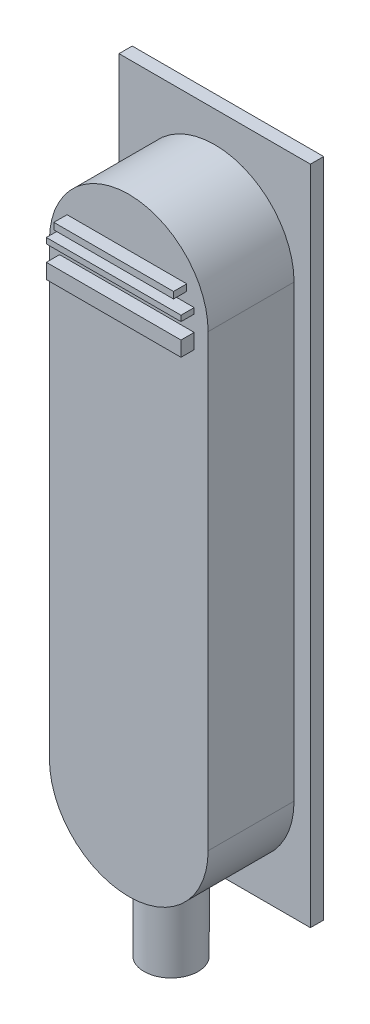
ISO-10303-21;
HEADER;
FILE_DESCRIPTION(('STEP AP214'),'2;1');
FILE_NAME('part.step','',(''),(''),'','','');
FILE_SCHEMA(('AUTOMOTIVE_DESIGN { 1 0 10303 214 1 1 1 1 }'));
ENDSEC;
DATA;
#1=APPLICATION_CONTEXT('core data for automotive mechanical design processes');
#2=APPLICATION_PROTOCOL_DEFINITION('international standard','automotive_design',2000,#1);
#3=PRODUCT_CONTEXT('',#1,'mechanical');
#4=PRODUCT('Part','Part','',(#3));
#5=PRODUCT_RELATED_PRODUCT_CATEGORY('part','',(#4));
#6=PRODUCT_DEFINITION_FORMATION('','',#4);
#7=PRODUCT_DEFINITION_CONTEXT('part definition',#1,'design');
#8=PRODUCT_DEFINITION('design','',#6,#7);
#9=PRODUCT_DEFINITION_SHAPE('','',#8);
#10=(LENGTH_UNIT() NAMED_UNIT(*) SI_UNIT(.MILLI.,.METRE.));
#11=(NAMED_UNIT(*) PLANE_ANGLE_UNIT() SI_UNIT($,.RADIAN.));
#12=(NAMED_UNIT(*) SI_UNIT($,.STERADIAN.) SOLID_ANGLE_UNIT());
#13=UNCERTAINTY_MEASURE_WITH_UNIT(LENGTH_MEASURE(1.E-05),#10,'distance_accuracy_value','');
#14=(GEOMETRIC_REPRESENTATION_CONTEXT(3) GLOBAL_UNCERTAINTY_ASSIGNED_CONTEXT((#13)) GLOBAL_UNIT_ASSIGNED_CONTEXT((#10,
#11,#12)) REPRESENTATION_CONTEXT('',''));
#15=CARTESIAN_POINT('',(0.,0.,0.));
#16=DIRECTION('',(0.,0.,1.));
#17=DIRECTION('',(1.,0.,0.));
#18=AXIS2_PLACEMENT_3D('',#15,#16,#17);
#19=CARTESIAN_POINT('',(-0.000521742011241834,-4.4779740051139,4.58345440240459));
#20=DIRECTION('',(0.,0.,-1.));
#21=DIRECTION('',(-1.,0.,0.));
#22=AXIS2_PLACEMENT_3D('',#19,#20,#21);
#23=CYLINDRICAL_SURFACE('',#22,1.5);
#24=CARTESIAN_POINT('',(-0.000521742011241834,-4.4779740051139,2.9584544024046));
#25=DIRECTION('',(0.,0.,1.));
#26=DIRECTION('',(1.,0.,0.));
#27=AXIS2_PLACEMENT_3D('',#24,#25,#26);
#28=CIRCLE('',#27,1.5);
#29=CARTESIAN_POINT('',(-1.50052174201124,-4.4779740051139,2.9584544024046));
#30=VERTEX_POINT('',#29);
#31=CARTESIAN_POINT('',(1.49947825798876,-4.4779740051139,2.9584544024046));
#32=VERTEX_POINT('',#31);
#33=EDGE_CURVE('E288',#30,#32,#28,.T.);
#34=ORIENTED_EDGE('',*,*,#33,.T.);
#35=DIRECTION('',(0.,0.,-1.));
#36=VECTOR('',#35,1.);
#37=CARTESIAN_POINT('',(1.49947825798876,-4.4779740051139,4.58345440240459));
#38=LINE('',#37,#36);
#39=CARTESIAN_POINT('',(1.49947825798876,-4.4779740051139,4.58345440240459));
#40=VERTEX_POINT('',#39);
#41=EDGE_CURVE('E295',#40,#32,#38,.T.);
#42=ORIENTED_EDGE('',*,*,#41,.F.);
#43=CARTESIAN_POINT('',(-0.000521742011241834,-4.4779740051139,4.58345440240459));
#44=DIRECTION('',(0.,0.,1.));
#45=DIRECTION('',(1.,0.,0.));
#46=AXIS2_PLACEMENT_3D('',#43,#44,#45);
#47=CIRCLE('',#46,1.5);
#48=CARTESIAN_POINT('',(-1.50052174201124,-4.4779740051139,4.58345440240459));
#49=VERTEX_POINT('',#48);
#50=EDGE_CURVE('E278',#49,#40,#47,.T.);
#51=ORIENTED_EDGE('',*,*,#50,.F.);
#52=DIRECTION('',(0.,0.,-1.));
#53=VECTOR('',#52,1.);
#54=CARTESIAN_POINT('',(-1.50052174201124,-4.4779740051139,4.58345440240459));
#55=LINE('',#54,#53);
#56=EDGE_CURVE('E298',#49,#30,#55,.T.);
#57=ORIENTED_EDGE('',*,*,#56,.T.);
#58=EDGE_LOOP('',(#34,#42,#51,#57));
#59=FACE_BOUND('',#58,.T.);
#60=CARTESIAN_POINT('',(0.,-5.97797391437566,3.27301159441511));
#61=CARTESIAN_POINT('',(0.0278596062312423,-5.97796439551194,3.27301133718254));
#62=CARTESIAN_POINT('',(0.0557171524043528,-5.97717128467946,3.27529636312219));
#63=CARTESIAN_POINT('',(0.110609010802156,-5.97410432053571,3.28434634134334));
#64=CARTESIAN_POINT('',(0.137643273193168,-5.97183037777485,3.29111156425131));
#65=CARTESIAN_POINT('',(0.190089328378379,-5.96604759221962,3.30886138390101));
#66=CARTESIAN_POINT('',(0.215503824775274,-5.9625408744391,3.3198387229067));
#67=CARTESIAN_POINT('',(0.264130524263755,-5.95464823053673,3.3456676499806));
#68=CARTESIAN_POINT('',(0.287342261463514,-5.95026211902771,3.36052005516035));
#69=CARTESIAN_POINT('',(0.331741622943114,-5.94089331207366,3.39423956675531));
#70=CARTESIAN_POINT('',(0.352838913457008,-5.93589585759858,3.41322149132755));
#71=CARTESIAN_POINT('',(0.391620188533736,-5.92594717733838,3.45441721375066));
#72=CARTESIAN_POINT('',(0.409303374389715,-5.92099596262792,3.4766317657265));
#73=CARTESIAN_POINT('',(0.441278622976148,-5.91153584305989,3.52448544728249));
#74=CARTESIAN_POINT('',(0.455451812991,-5.90704486704399,3.55020789392706));
#75=CARTESIAN_POINT('',(0.479231981948581,-5.89923899354879,3.60384935303553));
#76=CARTESIAN_POINT('',(0.488840432024218,-5.89592371725023,3.63176765442974));
#77=CARTESIAN_POINT('',(0.502875883786884,-5.89100080468927,3.68797651863999));
#78=CARTESIAN_POINT('',(0.507473063384227,-5.88933726668165,3.7162195434678));
#79=CARTESIAN_POINT('',(0.511887569865075,-5.88774091542438,3.77312129987456));
#80=CARTESIAN_POINT('',(0.511706456661077,-5.88780753734985,3.80177989273442));
#81=CARTESIAN_POINT('',(0.506701172635622,-5.88961518120781,3.85723328258244));
#82=CARTESIAN_POINT('',(0.502100941662519,-5.89127544192861,3.88405138693249));
#83=CARTESIAN_POINT('',(0.488754092161592,-5.89595096012649,3.93650946084317));
#84=CARTESIAN_POINT('',(0.480006955293608,-5.89896638698934,3.96214928268545));
#85=CARTESIAN_POINT('',(0.458472092414773,-5.90606874416386,4.01202291524384));
#86=CARTESIAN_POINT('',(0.445619436643038,-5.91017269948723,4.03622616039743));
#87=CARTESIAN_POINT('',(0.41628355465511,-5.91898316616598,4.08220211986134));
#88=CARTESIAN_POINT('',(0.399799240755676,-5.92368985786396,4.10397410305761));
#89=CARTESIAN_POINT('',(0.362600981872608,-5.93349145530541,4.14572524200795));
#90=CARTESIAN_POINT('',(0.341704630283148,-5.93859349414899,4.16554055143805));
#91=CARTESIAN_POINT('',(0.296823455717967,-5.94838645153926,4.2014294370227));
#92=CARTESIAN_POINT('',(0.272838307184198,-5.95307732666174,4.2175026182562));
#93=CARTESIAN_POINT('',(0.222099136400491,-5.96158712424596,4.24559204770108));
#94=CARTESIAN_POINT('',(0.195317850347669,-5.96539601425525,4.25756229758664));
#95=CARTESIAN_POINT('',(0.139960522387497,-5.97164032239769,4.27677605366025));
#96=CARTESIAN_POINT('',(0.11138513779979,-5.97407624033265,4.28402128004552));
#97=CARTESIAN_POINT('',(0.0546342008370358,-5.97721677631679,4.29328505992716));
#98=CARTESIAN_POINT('',(0.0264987122482518,-5.97799450298184,4.29552454405959));
#99=CARTESIAN_POINT('',(-0.0297532879968511,-5.97795269245184,4.29534472817881));
#100=CARTESIAN_POINT('',(-0.0578698021406586,-5.97713343973039,4.29292625789867));
#101=CARTESIAN_POINT('',(-0.112387008302642,-5.97403868752265,4.28367309813346));
#102=CARTESIAN_POINT('',(-0.138813877131954,-5.97180856015729,4.27697594239041));
#103=CARTESIAN_POINT('',(-0.190157275113954,-5.96616283103993,4.25952874083205));
#104=CARTESIAN_POINT('',(-0.215073610275224,-5.96274707740024,4.24877817572911));
#105=CARTESIAN_POINT('',(-0.263435162900429,-5.95496178497075,4.22321038298086));
#106=CARTESIAN_POINT('',(-0.286822913713625,-5.95056909833839,4.20829171031274));
#107=CARTESIAN_POINT('',(-0.330834046766069,-5.94132642865761,4.17492950279566));
#108=CARTESIAN_POINT('',(-0.351456548946232,-5.93647630085804,4.1564848502886));
#109=CARTESIAN_POINT('',(-0.390373864702713,-5.92657260872661,4.11555725544957));
#110=CARTESIAN_POINT('',(-0.408511245107669,-5.92152034459849,4.09292392979953));
#111=CARTESIAN_POINT('',(-0.440752108382872,-5.91201746493948,4.04482791080466));
#112=CARTESIAN_POINT('',(-0.454855511359112,-5.90756686132555,4.01936516143621));
#113=CARTESIAN_POINT('',(-0.478574408309836,-5.89981158514208,3.96629195147886));
#114=CARTESIAN_POINT('',(-0.488194859951625,-5.89650564773849,3.93868390298999));
#115=CARTESIAN_POINT('',(-0.502603380358287,-5.89147088062371,3.88210005210946));
#116=CARTESIAN_POINT('',(-0.507393752522889,-5.88974129920747,3.85312490857471));
#117=CARTESIAN_POINT('',(-0.5118215175772,-5.88814332630366,3.79629813445725));
#118=CARTESIAN_POINT('',(-0.511720972506329,-5.88818027954173,3.76846936791535));
#119=CARTESIAN_POINT('',(-0.507019305339643,-5.88987567365864,3.71324757491687));
#120=CARTESIAN_POINT('',(-0.502418474525789,-5.89153400959313,3.68585452037536));
#121=CARTESIAN_POINT('',(-0.489035915735052,-5.89621312780591,3.63284908579933));
#122=CARTESIAN_POINT('',(-0.480342840313674,-5.89920495215265,3.60721156327817));
#123=CARTESIAN_POINT('',(-0.459095294885371,-5.90620186262058,3.55773984383358));
#124=CARTESIAN_POINT('',(-0.446539944717411,-5.91020717966632,3.53390605950229));
#125=CARTESIAN_POINT('',(-0.41726307472797,-5.91900489410456,3.48755100424346));
#126=CARTESIAN_POINT('',(-0.400378999912287,-5.92382466981028,3.46513763248021));
#127=CARTESIAN_POINT('',(-0.363194584988623,-5.93359673250275,3.42337769646215));
#128=CARTESIAN_POINT('',(-0.342893260518153,-5.93854905732451,3.40403201900526));
#129=CARTESIAN_POINT('',(-0.29844404474193,-5.94827332683384,3.36814929624245));
#130=CARTESIAN_POINT('',(-0.274171882806647,-5.95302936512929,3.35176131664988));
#131=CARTESIAN_POINT('',(-0.223058383678518,-5.96160056066927,3.32331399037117));
#132=CARTESIAN_POINT('',(-0.19621756948444,-5.96541590888268,3.31125376488377));
#133=CARTESIAN_POINT('',(-0.141548144668828,-5.97157535236576,3.29217211429463));
#134=CARTESIAN_POINT('',(-0.113773097652423,-5.97396004273484,3.28501075685486));
#135=CARTESIAN_POINT('',(-0.0573311222770037,-5.9771639801519,3.27543135802868));
#136=CARTESIAN_POINT('',(-0.0286644707346247,-5.97798370823952,3.27301185907913));
#137=CARTESIAN_POINT('',(0.,-5.97797391437566,3.27301159441511));
#138=B_SPLINE_CURVE_WITH_KNOTS('',3,(#60,#61,#62,#63,#64,#65,#66,#67,#68,#69,#70,#71,#72,#73,
#74,#75,#76,#77,#78,#79,#80,#81,#82,#83,#84,#85,#86,#87,#88,#89,#90,#91,#92,#93,#94,#95,#96,#97,
#98,#99,#100,#101,#102,#103,#104,#105,#106,#107,#108,#109,#110,#111,#112,#113,#114,#115,#116,
#117,#118,#119,#120,#121,#122,#123,#124,#125,#126,#127,#128,#129,#130,#131,#132,#133,#134,#135,
#136,#137),.UNSPECIFIED.,.T.,.F.,(4,2,2,2,2,2,2,2,2,2,2,2,2,2,2,2,2,2,2,2,2,2,2,2,2,2,2,2,2,2,2,
2,2,2,2,2,2,2,4),(0.,0.0834732795698338,0.166951601806458,0.250286727004861,0.333639438793975,
0.419701885142729,0.505784440891467,0.594473116802835,0.683133190539577,0.768678408073519,
0.854195699022027,0.935596126441956,1.017006731146,1.09977453471567,1.18256716106086,
1.26990112607005,1.35724430359197,1.44553690753127,1.53379734959829,1.61807831584274,
1.7023442702966,1.78402923340105,1.86572466483175,1.94961374637959,2.03352946314643,
2.12143779903642,2.20934787585408,2.29716050139182,2.38493123043886,2.46800454412655,
2.55107248123195,2.63241831684304,2.71378270383795,2.79882194865023,2.88388573165956,
2.97246402858449,3.06102432845497,3.14693556424119,3.23282038829406),.UNSPECIFIED.);
#139=CARTESIAN_POINT('',(0.,-5.97797391437566,3.27301159441511));
#140=VERTEX_POINT('',#139);
#141=EDGE_CURVE('E11',#140,#140,#138,.T.);
#142=ORIENTED_EDGE('',*,*,#141,.F.);
#143=EDGE_LOOP('',(#142));
#144=FACE_BOUND('',#143,.T.);
#145=ADVANCED_FACE('F40',(#59,#144),#23,.T.);
#146=CARTESIAN_POINT('',(-0.000521742011241656,4.0220259948861,4.58345440240459));
#147=DIRECTION('',(0.,0.,1.));
#148=DIRECTION('',(1.,0.,0.));
#149=AXIS2_PLACEMENT_3D('',#146,#147,#148);
#150=PLANE('',#149);
#151=CARTESIAN_POINT('',(-0.000521742011241656,4.0220259948861,4.58345440240459));
#152=DIRECTION('',(0.,0.,1.));
#153=DIRECTION('',(1.,0.,0.));
#154=AXIS2_PLACEMENT_3D('',#151,#152,#153);
#155=CIRCLE('',#154,1.5);
#156=CARTESIAN_POINT('',(1.49947825798876,4.0220259948861,4.58345440240459));
#157=VERTEX_POINT('',#156);
#158=CARTESIAN_POINT('',(-1.50052174201124,4.0220259948861,4.58345440240459));
#159=VERTEX_POINT('',#158);
#160=EDGE_CURVE('E272',#157,#159,#155,.T.);
#161=ORIENTED_EDGE('',*,*,#160,.T.);
#162=DIRECTION('',(0.,-1.,0.));
#163=VECTOR('',#162,1.);
#164=CARTESIAN_POINT('',(-1.50052174201124,4.0220259948861,4.58345440240459));
#165=LINE('',#164,#163);
#166=EDGE_CURVE('E275',#159,#49,#165,.T.);
#167=ORIENTED_EDGE('',*,*,#166,.T.);
#168=ORIENTED_EDGE('',*,*,#50,.T.);
#169=DIRECTION('',(0.,1.,0.));
#170=VECTOR('',#169,1.);
#171=CARTESIAN_POINT('',(1.49947825798876,4.0220259948861,4.58345440240459));
#172=LINE('',#171,#170);
#173=EDGE_CURVE('E280',#40,#157,#172,.T.);
#174=ORIENTED_EDGE('',*,*,#173,.T.);
#175=EDGE_LOOP('',(#161,#167,#168,#174));
#176=FACE_BOUND('',#175,.T.);
#177=DIRECTION('',(1.,0.,0.));
#178=VECTOR('',#177,1.);
#179=CARTESIAN_POINT('',(-1.16730305464865,4.47972652427751,4.58345440240459));
#180=LINE('',#179,#178);
#181=CARTESIAN_POINT('',(-1.16730305464865,4.47972652427751,4.58345440240459));
#182=VERTEX_POINT('',#181);
#183=CARTESIAN_POINT('',(1.09554555167844,4.47972652427751,4.58345440240459));
#184=VERTEX_POINT('',#183);
#185=EDGE_CURVE('E256',#182,#184,#180,.T.);
#186=ORIENTED_EDGE('',*,*,#185,.F.);
#187=DIRECTION('',(0.,-1.,0.));
#188=VECTOR('',#187,1.);
#189=CARTESIAN_POINT('',(-1.16730305464865,4.60347605743602,4.58345440240459));
#190=LINE('',#189,#188);
#191=CARTESIAN_POINT('',(-1.16730305464865,4.60347605743602,4.58345440240459));
#192=VERTEX_POINT('',#191);
#193=EDGE_CURVE('E235',#192,#182,#190,.T.);
#194=ORIENTED_EDGE('',*,*,#193,.F.);
#195=DIRECTION('',(-1.,0.,0.));
#196=VECTOR('',#195,1.);
#197=CARTESIAN_POINT('',(-1.16730305464865,4.60347605743602,4.58345440240459));
#198=LINE('',#197,#196);
#199=CARTESIAN_POINT('',(1.09554555167844,4.60347605743602,4.58345440240459));
#200=VERTEX_POINT('',#199);
#201=EDGE_CURVE('E247',#200,#192,#198,.T.);
#202=ORIENTED_EDGE('',*,*,#201,.F.);
#203=DIRECTION('',(0.,1.,0.));
#204=VECTOR('',#203,1.);
#205=CARTESIAN_POINT('',(1.09554555167844,4.60347605743602,4.58345440240459));
#206=LINE('',#205,#204);
#207=EDGE_CURVE('E258',#184,#200,#206,.T.);
#208=ORIENTED_EDGE('',*,*,#207,.F.);
#209=EDGE_LOOP('',(#186,#194,#202,#208));
#210=FACE_BOUND('',#209,.T.);
#211=DIRECTION('',(1.,0.,0.));
#212=VECTOR('',#211,1.);
#213=CARTESIAN_POINT('',(-1.30873109254409,4.17919194374969,4.58345440240459));
#214=LINE('',#213,#212);
#215=CARTESIAN_POINT('',(-1.30873109254409,4.17919194374969,4.58345440240459));
#216=VERTEX_POINT('',#215);
#217=CARTESIAN_POINT('',(1.23697358957388,4.17919194374969,4.58345440240459));
#218=VERTEX_POINT('',#217);
#219=EDGE_CURVE('E230',#216,#218,#214,.T.);
#220=ORIENTED_EDGE('',*,*,#219,.F.);
#221=DIRECTION('',(0.,-1.,0.));
#222=VECTOR('',#221,1.);
#223=CARTESIAN_POINT('',(-1.30873109254409,4.28526297217127,4.58345440240459));
#224=LINE('',#223,#222);
#225=CARTESIAN_POINT('',(-1.30873109254409,4.28526297217127,4.58345440240459));
#226=VERTEX_POINT('',#225);
#227=EDGE_CURVE('E232',#226,#216,#224,.T.);
#228=ORIENTED_EDGE('',*,*,#227,.F.);
#229=DIRECTION('',(-1.,0.,0.));
#230=VECTOR('',#229,1.);
#231=CARTESIAN_POINT('',(-1.30873109254409,4.28526297217127,4.58345440240459));
#232=LINE('',#231,#230);
#233=CARTESIAN_POINT('',(1.23697358957388,4.28526297217127,4.58345440240459));
#234=VERTEX_POINT('',#233);
#235=EDGE_CURVE('E225',#234,#226,#232,.T.);
#236=ORIENTED_EDGE('',*,*,#235,.F.);
#237=DIRECTION('',(0.,1.,0.));
#238=VECTOR('',#237,1.);
#239=CARTESIAN_POINT('',(1.23697358957388,4.28526297217127,4.58345440240459));
#240=LINE('',#239,#238);
#241=EDGE_CURVE('E227',#218,#234,#240,.T.);
#242=ORIENTED_EDGE('',*,*,#241,.F.);
#243=EDGE_LOOP('',(#220,#228,#236,#242));
#244=FACE_BOUND('',#243,.T.);
#245=DIRECTION('',(1.,0.,0.));
#246=VECTOR('',#245,1.);
#247=CARTESIAN_POINT('',(-1.30873109254409,3.59580128743099,4.58345440240459));
#248=LINE('',#247,#246);
#249=CARTESIAN_POINT('',(-1.30873109254409,3.59580128743099,4.58345440240459));
#250=VERTEX_POINT('',#249);
#251=CARTESIAN_POINT('',(1.23697358957388,3.59580128743099,4.58345440240459));
#252=VERTEX_POINT('',#251);
#253=EDGE_CURVE('E204',#250,#252,#248,.T.);
#254=ORIENTED_EDGE('',*,*,#253,.F.);
#255=DIRECTION('',(0.,-1.,0.));
#256=VECTOR('',#255,1.);
#257=CARTESIAN_POINT('',(-1.30873109254409,3.87865736322187,4.58345440240459));
#258=LINE('',#257,#256);
#259=CARTESIAN_POINT('',(-1.30873109254409,3.87865736322187,4.58345440240459));
#260=VERTEX_POINT('',#259);
#261=EDGE_CURVE('E198',#260,#250,#258,.T.);
#262=ORIENTED_EDGE('',*,*,#261,.F.);
#263=DIRECTION('',(-1.,0.,0.));
#264=VECTOR('',#263,1.);
#265=CARTESIAN_POINT('',(-1.30873109254409,3.87865736322187,4.58345440240459));
#266=LINE('',#265,#264);
#267=CARTESIAN_POINT('',(1.23697358957388,3.87865736322187,4.58345440240459));
#268=VERTEX_POINT('',#267);
#269=EDGE_CURVE('E183',#268,#260,#266,.T.);
#270=ORIENTED_EDGE('',*,*,#269,.F.);
#271=DIRECTION('',(0.,1.,0.));
#272=VECTOR('',#271,1.);
#273=CARTESIAN_POINT('',(1.23697358957388,3.87865736322187,4.58345440240459));
#274=LINE('',#273,#272);
#275=EDGE_CURVE('E191',#252,#268,#274,.T.);
#276=ORIENTED_EDGE('',*,*,#275,.F.);
#277=EDGE_LOOP('',(#254,#262,#270,#276));
#278=FACE_BOUND('',#277,.T.);
#279=ADVANCED_FACE('F203',(#176,#210,#244,#278),#150,.T.);
#280=CARTESIAN_POINT('',(-1.81014872491624,-6.39582654831106,2.9584544024046));
#281=DIRECTION('',(1.,0.,0.));
#282=DIRECTION('',(0.,0.,-1.));
#283=AXIS2_PLACEMENT_3D('',#280,#281,#282);
#284=PLANE('',#283);
#285=DIRECTION('',(0.,-1.,0.));
#286=VECTOR('',#285,1.);
#287=CARTESIAN_POINT('',(-1.81014872491624,-6.39582654831106,2.70845440240459));
#288=LINE('',#287,#286);
#289=CARTESIAN_POINT('',(-1.81014872491624,6.10719808493144,2.70845440240459));
#290=VERTEX_POINT('',#289);
#291=CARTESIAN_POINT('',(-1.81014872491624,-6.39582654831106,2.70845440240459));
#292=VERTEX_POINT('',#291);
#293=EDGE_CURVE('E304',#290,#292,#288,.T.);
#294=ORIENTED_EDGE('',*,*,#293,.T.);
#295=DIRECTION('',(0.,0.,-1.));
#296=VECTOR('',#295,1.);
#297=CARTESIAN_POINT('',(-1.81014872491624,-6.39582654831106,2.9584544024046));
#298=LINE('',#297,#296);
#299=CARTESIAN_POINT('',(-1.81014872491624,-6.39582654831106,2.9584544024046));
#300=VERTEX_POINT('',#299);
#301=EDGE_CURVE('E53',#300,#292,#298,.T.);
#302=ORIENTED_EDGE('',*,*,#301,.F.);
#303=DIRECTION('',(0.,-1.,0.));
#304=VECTOR('',#303,1.);
#305=CARTESIAN_POINT('',(-1.81014872491624,-6.39582654831106,2.9584544024046));
#306=LINE('',#305,#304);
#307=CARTESIAN_POINT('',(-1.81014872491624,6.10719808493144,2.9584544024046));
#308=VERTEX_POINT('',#307);
#309=EDGE_CURVE('E305',#308,#300,#306,.T.);
#310=ORIENTED_EDGE('',*,*,#309,.F.);
#311=DIRECTION('',(0.,0.,-1.));
#312=VECTOR('',#311,1.);
#313=CARTESIAN_POINT('',(-1.81014872491624,6.10719808493144,2.9584544024046));
#314=LINE('',#313,#312);
#315=EDGE_CURVE('E315',#308,#290,#314,.T.);
#316=ORIENTED_EDGE('',*,*,#315,.T.);
#317=EDGE_LOOP('',(#294,#302,#310,#316));
#318=FACE_BOUND('',#317,.T.);
#319=ADVANCED_FACE('F42',(#318),#284,.F.);
#320=CARTESIAN_POINT('',(1.80910524089376,-6.39582654831106,2.9584544024046));
#321=DIRECTION('',(0.,1.,0.));
#322=DIRECTION('',(0.,0.,1.));
#323=AXIS2_PLACEMENT_3D('',#320,#321,#322);
#324=PLANE('',#323);
#325=DIRECTION('',(1.,0.,0.));
#326=VECTOR('',#325,1.);
#327=CARTESIAN_POINT('',(1.80910524089376,-6.39582654831106,2.70845440240459));
#328=LINE('',#327,#326);
#329=CARTESIAN_POINT('',(1.80910524089376,-6.39582654831106,2.70845440240459));
#330=VERTEX_POINT('',#329);
#331=EDGE_CURVE('E318',#292,#330,#328,.T.);
#332=ORIENTED_EDGE('',*,*,#331,.T.);
#333=DIRECTION('',(0.,0.,-1.));
#334=VECTOR('',#333,1.);
#335=CARTESIAN_POINT('',(1.80910524089376,-6.39582654831106,2.9584544024046));
#336=LINE('',#335,#334);
#337=CARTESIAN_POINT('',(1.80910524089376,-6.39582654831106,2.9584544024046));
#338=VERTEX_POINT('',#337);
#339=EDGE_CURVE('E328',#338,#330,#336,.T.);
#340=ORIENTED_EDGE('',*,*,#339,.F.);
#341=DIRECTION('',(1.,0.,0.));
#342=VECTOR('',#341,1.);
#343=CARTESIAN_POINT('',(1.80910524089376,-6.39582654831106,2.9584544024046));
#344=LINE('',#343,#342);
#345=EDGE_CURVE('E308',#300,#338,#344,.T.);
#346=ORIENTED_EDGE('',*,*,#345,.F.);
#347=ORIENTED_EDGE('',*,*,#301,.T.);
#348=EDGE_LOOP('',(#332,#340,#346,#347));
#349=FACE_BOUND('',#348,.T.);
#350=ADVANCED_FACE('F333',(#349),#324,.F.);
#351=CARTESIAN_POINT('',(1.80910524089376,-6.39582654831106,2.9584544024046));
#352=DIRECTION('',(-1.,0.,0.));
#353=DIRECTION('',(0.,0.,1.));
#354=AXIS2_PLACEMENT_3D('',#351,#352,#353);
#355=PLANE('',#354);
#356=DIRECTION('',(0.,1.,0.));
#357=VECTOR('',#356,1.);
#358=CARTESIAN_POINT('',(1.80910524089376,-6.39582654831106,2.70845440240459));
#359=LINE('',#358,#357);
#360=CARTESIAN_POINT('',(1.80910524089376,6.10719808493144,2.70845440240459));
#361=VERTEX_POINT('',#360);
#362=EDGE_CURVE('E320',#330,#361,#359,.T.);
#363=ORIENTED_EDGE('',*,*,#362,.T.);
#364=DIRECTION('',(0.,0.,-1.));
#365=VECTOR('',#364,1.);
#366=CARTESIAN_POINT('',(1.80910524089376,6.10719808493144,2.9584544024046));
#367=LINE('',#366,#365);
#368=CARTESIAN_POINT('',(1.80910524089376,6.10719808493144,2.9584544024046));
#369=VERTEX_POINT('',#368);
#370=EDGE_CURVE('E325',#369,#361,#367,.T.);
#371=ORIENTED_EDGE('',*,*,#370,.F.);
#372=DIRECTION('',(0.,1.,0.));
#373=VECTOR('',#372,1.);
#374=CARTESIAN_POINT('',(1.80910524089376,-6.39582654831106,2.9584544024046));
#375=LINE('',#374,#373);
#376=EDGE_CURVE('E311',#338,#369,#375,.T.);
#377=ORIENTED_EDGE('',*,*,#376,.F.);
#378=ORIENTED_EDGE('',*,*,#339,.T.);
#379=EDGE_LOOP('',(#363,#371,#377,#378));
#380=FACE_BOUND('',#379,.T.);
#381=ADVANCED_FACE('F345',(#380),#355,.F.);
#382=CARTESIAN_POINT('',(1.80910524089376,6.10719808493144,2.9584544024046));
#383=DIRECTION('',(0.,-1.,0.));
#384=DIRECTION('',(0.,0.,-1.));
#385=AXIS2_PLACEMENT_3D('',#382,#383,#384);
#386=PLANE('',#385);
#387=DIRECTION('',(-1.,0.,0.));
#388=VECTOR('',#387,1.);
#389=CARTESIAN_POINT('',(1.80910524089376,6.10719808493144,2.70845440240459));
#390=LINE('',#389,#388);
#391=EDGE_CURVE('E309',#361,#290,#390,.T.);
#392=ORIENTED_EDGE('',*,*,#391,.T.);
#393=ORIENTED_EDGE('',*,*,#315,.F.);
#394=DIRECTION('',(-1.,0.,0.));
#395=VECTOR('',#394,1.);
#396=CARTESIAN_POINT('',(1.80910524089376,6.10719808493144,2.9584544024046));
#397=LINE('',#396,#395);
#398=EDGE_CURVE('E313',#369,#308,#397,.T.);
#399=ORIENTED_EDGE('',*,*,#398,.F.);
#400=ORIENTED_EDGE('',*,*,#370,.T.);
#401=EDGE_LOOP('',(#392,#393,#399,#400));
#402=FACE_BOUND('',#401,.T.);
#403=ADVANCED_FACE('F349',(#402),#386,.F.);
#404=CARTESIAN_POINT('',(-0.000521742011241656,-0.14431423168981,2.9584544024046));
#405=DIRECTION('',(0.,0.,1.));
#406=DIRECTION('',(1.,0.,0.));
#407=AXIS2_PLACEMENT_3D('',#404,#405,#406);
#408=PLANE('',#407);
#409=CARTESIAN_POINT('',(-0.000521742011241656,4.0220259948861,2.9584544024046));
#410=DIRECTION('',(0.,0.,1.));
#411=DIRECTION('',(1.,0.,0.));
#412=AXIS2_PLACEMENT_3D('',#409,#410,#411);
#413=CIRCLE('',#412,1.5);
#414=CARTESIAN_POINT('',(1.49947825798876,4.0220259948861,2.9584544024046));
#415=VERTEX_POINT('',#414);
#416=CARTESIAN_POINT('',(-1.50052174201124,4.0220259948861,2.9584544024046));
#417=VERTEX_POINT('',#416);
#418=EDGE_CURVE('E271',#415,#417,#413,.T.);
#419=ORIENTED_EDGE('',*,*,#418,.F.);
#420=DIRECTION('',(0.,1.,0.));
#421=VECTOR('',#420,1.);
#422=CARTESIAN_POINT('',(1.49947825798876,4.0220259948861,2.9584544024046));
#423=LINE('',#422,#421);
#424=EDGE_CURVE('E276',#32,#415,#423,.T.);
#425=ORIENTED_EDGE('',*,*,#424,.F.);
#426=ORIENTED_EDGE('',*,*,#33,.F.);
#427=DIRECTION('',(0.,-1.,0.));
#428=VECTOR('',#427,1.);
#429=CARTESIAN_POINT('',(-1.50052174201124,4.0220259948861,2.9584544024046));
#430=LINE('',#429,#428);
#431=EDGE_CURVE('E285',#417,#30,#430,.T.);
#432=ORIENTED_EDGE('',*,*,#431,.F.);
#433=EDGE_LOOP('',(#419,#425,#426,#432));
#434=FACE_BOUND('',#433,.T.);
#435=ORIENTED_EDGE('',*,*,#309,.T.);
#436=ORIENTED_EDGE('',*,*,#345,.T.);
#437=ORIENTED_EDGE('',*,*,#376,.T.);
#438=ORIENTED_EDGE('',*,*,#398,.T.);
#439=EDGE_LOOP('',(#435,#436,#437,#438));
#440=FACE_BOUND('',#439,.T.);
#441=ADVANCED_FACE('F351',(#434,#440),#408,.T.);
#442=CARTESIAN_POINT('',(-0.000521742011241656,-0.14431423168981,2.70845440240459));
#443=DIRECTION('',(0.,0.,1.));
#444=DIRECTION('',(1.,0.,0.));
#445=AXIS2_PLACEMENT_3D('',#442,#443,#444);
#446=PLANE('',#445);
#447=ORIENTED_EDGE('',*,*,#293,.F.);
#448=ORIENTED_EDGE('',*,*,#391,.F.);
#449=ORIENTED_EDGE('',*,*,#362,.F.);
#450=ORIENTED_EDGE('',*,*,#331,.F.);
#451=EDGE_LOOP('',(#447,#448,#449,#450));
#452=FACE_BOUND('',#451,.T.);
#453=ADVANCED_FACE('F341',(#452),#446,.F.);
#454=CARTESIAN_POINT('',(-0.000521742011241656,4.0220259948861,4.58345440240459));
#455=DIRECTION('',(0.,0.,-1.));
#456=DIRECTION('',(-1.,0.,0.));
#457=AXIS2_PLACEMENT_3D('',#454,#455,#456);
#458=CYLINDRICAL_SURFACE('',#457,1.5);
#459=ORIENTED_EDGE('',*,*,#418,.T.);
#460=DIRECTION('',(0.,0.,-1.));
#461=VECTOR('',#460,1.);
#462=CARTESIAN_POINT('',(-1.50052174201124,4.0220259948861,4.58345440240459));
#463=LINE('',#462,#461);
#464=EDGE_CURVE('E301',#159,#417,#463,.T.);
#465=ORIENTED_EDGE('',*,*,#464,.F.);
#466=ORIENTED_EDGE('',*,*,#160,.F.);
#467=DIRECTION('',(0.,0.,-1.));
#468=VECTOR('',#467,1.);
#469=CARTESIAN_POINT('',(1.49947825798876,4.0220259948861,4.58345440240459));
#470=LINE('',#469,#468);
#471=EDGE_CURVE('E282',#157,#415,#470,.T.);
#472=ORIENTED_EDGE('',*,*,#471,.T.);
#473=EDGE_LOOP('',(#459,#465,#466,#472));
#474=FACE_BOUND('',#473,.T.);
#475=ADVANCED_FACE('F359',(#474),#458,.T.);
#476=CARTESIAN_POINT('',(-1.50052174201124,4.0220259948861,4.58345440240459));
#477=DIRECTION('',(1.,0.,0.));
#478=DIRECTION('',(0.,1.,0.));
#479=AXIS2_PLACEMENT_3D('',#476,#477,#478);
#480=PLANE('',#479);
#481=ORIENTED_EDGE('',*,*,#431,.T.);
#482=ORIENTED_EDGE('',*,*,#56,.F.);
#483=ORIENTED_EDGE('',*,*,#166,.F.);
#484=ORIENTED_EDGE('',*,*,#464,.T.);
#485=EDGE_LOOP('',(#481,#482,#483,#484));
#486=FACE_BOUND('',#485,.T.);
#487=ADVANCED_FACE('F375',(#486),#480,.F.);
#488=CARTESIAN_POINT('',(1.49947825798876,4.0220259948861,4.58345440240459));
#489=DIRECTION('',(-1.,0.,0.));
#490=DIRECTION('',(0.,-1.,0.));
#491=AXIS2_PLACEMENT_3D('',#488,#489,#490);
#492=PLANE('',#491);
#493=ORIENTED_EDGE('',*,*,#424,.T.);
#494=ORIENTED_EDGE('',*,*,#471,.F.);
#495=ORIENTED_EDGE('',*,*,#173,.F.);
#496=ORIENTED_EDGE('',*,*,#41,.T.);
#497=EDGE_LOOP('',(#493,#494,#495,#496));
#498=FACE_BOUND('',#497,.T.);
#499=ADVANCED_FACE('F374',(#498),#492,.F.);
#500=CARTESIAN_POINT('',(-1.16730305464865,4.60347605743602,4.83345440240459));
#501=DIRECTION('',(1.,0.,0.));
#502=DIRECTION('',(0.,0.,-1.));
#503=AXIS2_PLACEMENT_3D('',#500,#501,#502);
#504=PLANE('',#503);
#505=ORIENTED_EDGE('',*,*,#193,.T.);
#506=DIRECTION('',(0.,0.,-1.));
#507=VECTOR('',#506,1.);
#508=CARTESIAN_POINT('',(-1.16730305464865,4.47972652427751,4.83345440240459));
#509=LINE('',#508,#507);
#510=CARTESIAN_POINT('',(-1.16730305464865,4.47972652427751,4.83345440240459));
#511=VERTEX_POINT('',#510);
#512=EDGE_CURVE('E269',#511,#182,#509,.T.);
#513=ORIENTED_EDGE('',*,*,#512,.F.);
#514=DIRECTION('',(0.,-1.,0.));
#515=VECTOR('',#514,1.);
#516=CARTESIAN_POINT('',(-1.16730305464865,4.60347605743602,4.83345440240459));
#517=LINE('',#516,#515);
#518=CARTESIAN_POINT('',(-1.16730305464865,4.60347605743602,4.83345440240459));
#519=VERTEX_POINT('',#518);
#520=EDGE_CURVE('E243',#519,#511,#517,.T.);
#521=ORIENTED_EDGE('',*,*,#520,.F.);
#522=DIRECTION('',(0.,0.,-1.));
#523=VECTOR('',#522,1.);
#524=CARTESIAN_POINT('',(-1.16730305464865,4.60347605743602,4.83345440240459));
#525=LINE('',#524,#523);
#526=EDGE_CURVE('E253',#519,#192,#525,.T.);
#527=ORIENTED_EDGE('',*,*,#526,.T.);
#528=EDGE_LOOP('',(#505,#513,#521,#527));
#529=FACE_BOUND('',#528,.T.);
#530=ADVANCED_FACE('F438',(#529),#504,.F.);
#531=CARTESIAN_POINT('',(-1.16730305464865,4.47972652427751,4.83345440240459));
#532=DIRECTION('',(0.,1.,0.));
#533=DIRECTION('',(0.,0.,1.));
#534=AXIS2_PLACEMENT_3D('',#531,#532,#533);
#535=PLANE('',#534);
#536=ORIENTED_EDGE('',*,*,#185,.T.);
#537=DIRECTION('',(0.,0.,-1.));
#538=VECTOR('',#537,1.);
#539=CARTESIAN_POINT('',(1.09554555167844,4.47972652427751,4.83345440240459));
#540=LINE('',#539,#538);
#541=CARTESIAN_POINT('',(1.09554555167844,4.47972652427751,4.83345440240459));
#542=VERTEX_POINT('',#541);
#543=EDGE_CURVE('E266',#542,#184,#540,.T.);
#544=ORIENTED_EDGE('',*,*,#543,.F.);
#545=DIRECTION('',(1.,0.,0.));
#546=VECTOR('',#545,1.);
#547=CARTESIAN_POINT('',(-1.16730305464865,4.47972652427751,4.83345440240459));
#548=LINE('',#547,#546);
#549=EDGE_CURVE('E246',#511,#542,#548,.T.);
#550=ORIENTED_EDGE('',*,*,#549,.F.);
#551=ORIENTED_EDGE('',*,*,#512,.T.);
#552=EDGE_LOOP('',(#536,#544,#550,#551));
#553=FACE_BOUND('',#552,.T.);
#554=ADVANCED_FACE('F434',(#553),#535,.F.);
#555=CARTESIAN_POINT('',(1.09554555167844,4.60347605743602,4.83345440240459));
#556=DIRECTION('',(-1.,0.,0.));
#557=DIRECTION('',(0.,0.,1.));
#558=AXIS2_PLACEMENT_3D('',#555,#556,#557);
#559=PLANE('',#558);
#560=ORIENTED_EDGE('',*,*,#207,.T.);
#561=DIRECTION('',(0.,0.,-1.));
#562=VECTOR('',#561,1.);
#563=CARTESIAN_POINT('',(1.09554555167844,4.60347605743602,4.83345440240459));
#564=LINE('',#563,#562);
#565=CARTESIAN_POINT('',(1.09554555167844,4.60347605743602,4.83345440240459));
#566=VERTEX_POINT('',#565);
#567=EDGE_CURVE('E264',#566,#200,#564,.T.);
#568=ORIENTED_EDGE('',*,*,#567,.F.);
#569=DIRECTION('',(0.,1.,0.));
#570=VECTOR('',#569,1.);
#571=CARTESIAN_POINT('',(1.09554555167844,4.60347605743602,4.83345440240459));
#572=LINE('',#571,#570);
#573=EDGE_CURVE('E249',#542,#566,#572,.T.);
#574=ORIENTED_EDGE('',*,*,#573,.F.);
#575=ORIENTED_EDGE('',*,*,#543,.T.);
#576=EDGE_LOOP('',(#560,#568,#574,#575));
#577=FACE_BOUND('',#576,.T.);
#578=ADVANCED_FACE('F430',(#577),#559,.F.);
#579=CARTESIAN_POINT('',(-1.16730305464865,4.60347605743602,4.83345440240459));
#580=DIRECTION('',(0.,-1.,0.));
#581=DIRECTION('',(0.,0.,-1.));
#582=AXIS2_PLACEMENT_3D('',#579,#580,#581);
#583=PLANE('',#582);
#584=ORIENTED_EDGE('',*,*,#201,.T.);
#585=ORIENTED_EDGE('',*,*,#526,.F.);
#586=DIRECTION('',(-1.,0.,0.));
#587=VECTOR('',#586,1.);
#588=CARTESIAN_POINT('',(-1.16730305464865,4.60347605743602,4.83345440240459));
#589=LINE('',#588,#587);
#590=EDGE_CURVE('E251',#566,#519,#589,.T.);
#591=ORIENTED_EDGE('',*,*,#590,.F.);
#592=ORIENTED_EDGE('',*,*,#567,.T.);
#593=EDGE_LOOP('',(#584,#585,#591,#592));
#594=FACE_BOUND('',#593,.T.);
#595=ADVANCED_FACE('F426',(#594),#583,.F.);
#596=CARTESIAN_POINT('',(-0.000521742011241656,-0.14431423168981,4.83345440240459));
#597=DIRECTION('',(0.,0.,1.));
#598=DIRECTION('',(1.,0.,0.));
#599=AXIS2_PLACEMENT_3D('',#596,#597,#598);
#600=PLANE('',#599);
#601=ORIENTED_EDGE('',*,*,#520,.T.);
#602=ORIENTED_EDGE('',*,*,#549,.T.);
#603=ORIENTED_EDGE('',*,*,#573,.T.);
#604=ORIENTED_EDGE('',*,*,#590,.T.);
#605=EDGE_LOOP('',(#601,#602,#603,#604));
#606=FACE_BOUND('',#605,.T.);
#607=ADVANCED_FACE('F423',(#606),#600,.T.);
#608=CARTESIAN_POINT('',(-1.30873109254409,4.28526297217127,4.83345440240459));
#609=DIRECTION('',(1.,0.,0.));
#610=DIRECTION('',(0.,0.,-1.));
#611=AXIS2_PLACEMENT_3D('',#608,#609,#610);
#612=PLANE('',#611);
#613=ORIENTED_EDGE('',*,*,#227,.T.);
#614=DIRECTION('',(0.,0.,-1.));
#615=VECTOR('',#614,1.);
#616=CARTESIAN_POINT('',(-1.30873109254409,4.17919194374969,4.83345440240459));
#617=LINE('',#616,#615);
#618=CARTESIAN_POINT('',(-1.30873109254409,4.17919194374969,4.83345440240459));
#619=VERTEX_POINT('',#618);
#620=EDGE_CURVE('E205',#619,#216,#617,.T.);
#621=ORIENTED_EDGE('',*,*,#620,.F.);
#622=DIRECTION('',(0.,-1.,0.));
#623=VECTOR('',#622,1.);
#624=CARTESIAN_POINT('',(-1.30873109254409,4.28526297217127,4.83345440240459));
#625=LINE('',#624,#623);
#626=CARTESIAN_POINT('',(-1.30873109254409,4.28526297217127,4.83345440240459));
#627=VERTEX_POINT('',#626);
#628=EDGE_CURVE('E228',#627,#619,#625,.T.);
#629=ORIENTED_EDGE('',*,*,#628,.F.);
#630=DIRECTION('',(0.,0.,-1.));
#631=VECTOR('',#630,1.);
#632=CARTESIAN_POINT('',(-1.30873109254409,4.28526297217127,4.83345440240459));
#633=LINE('',#632,#631);
#634=EDGE_CURVE('E221',#627,#226,#633,.T.);
#635=ORIENTED_EDGE('',*,*,#634,.T.);
#636=EDGE_LOOP('',(#613,#621,#629,#635));
#637=FACE_BOUND('',#636,.T.);
#638=ADVANCED_FACE('F411',(#637),#612,.F.);
#639=CARTESIAN_POINT('',(-1.30873109254409,4.17919194374969,4.83345440240459));
#640=DIRECTION('',(0.,1.,0.));
#641=DIRECTION('',(0.,0.,1.));
#642=AXIS2_PLACEMENT_3D('',#639,#640,#641);
#643=PLANE('',#642);
#644=ORIENTED_EDGE('',*,*,#219,.T.);
#645=DIRECTION('',(0.,0.,-1.));
#646=VECTOR('',#645,1.);
#647=CARTESIAN_POINT('',(1.23697358957388,4.17919194374969,4.83345440240459));
#648=LINE('',#647,#646);
#649=CARTESIAN_POINT('',(1.23697358957388,4.17919194374969,4.83345440240459));
#650=VERTEX_POINT('',#649);
#651=EDGE_CURVE('E207',#650,#218,#648,.T.);
#652=ORIENTED_EDGE('',*,*,#651,.F.);
#653=DIRECTION('',(1.,0.,0.));
#654=VECTOR('',#653,1.);
#655=CARTESIAN_POINT('',(-1.30873109254409,4.17919194374969,4.83345440240459));
#656=LINE('',#655,#654);
#657=EDGE_CURVE('E239',#619,#650,#656,.T.);
#658=ORIENTED_EDGE('',*,*,#657,.F.);
#659=ORIENTED_EDGE('',*,*,#620,.T.);
#660=EDGE_LOOP('',(#644,#652,#658,#659));
#661=FACE_BOUND('',#660,.T.);
#662=ADVANCED_FACE('F401',(#661),#643,.F.);
#663=CARTESIAN_POINT('',(1.23697358957388,4.28526297217127,4.83345440240459));
#664=DIRECTION('',(-1.,0.,0.));
#665=DIRECTION('',(0.,0.,1.));
#666=AXIS2_PLACEMENT_3D('',#663,#664,#665);
#667=PLANE('',#666);
#668=ORIENTED_EDGE('',*,*,#241,.T.);
#669=DIRECTION('',(0.,0.,-1.));
#670=VECTOR('',#669,1.);
#671=CARTESIAN_POINT('',(1.23697358957388,4.28526297217127,4.83345440240459));
#672=LINE('',#671,#670);
#673=CARTESIAN_POINT('',(1.23697358957388,4.28526297217127,4.83345440240459));
#674=VERTEX_POINT('',#673);
#675=EDGE_CURVE('E68',#674,#234,#672,.T.);
#676=ORIENTED_EDGE('',*,*,#675,.F.);
#677=DIRECTION('',(0.,1.,0.));
#678=VECTOR('',#677,1.);
#679=CARTESIAN_POINT('',(1.23697358957388,4.28526297217127,4.83345440240459));
#680=LINE('',#679,#678);
#681=EDGE_CURVE('E237',#650,#674,#680,.T.);
#682=ORIENTED_EDGE('',*,*,#681,.F.);
#683=ORIENTED_EDGE('',*,*,#651,.T.);
#684=EDGE_LOOP('',(#668,#676,#682,#683));
#685=FACE_BOUND('',#684,.T.);
#686=ADVANCED_FACE('F405',(#685),#667,.F.);
#687=CARTESIAN_POINT('',(-1.30873109254409,4.28526297217127,4.83345440240459));
#688=DIRECTION('',(0.,-1.,0.));
#689=DIRECTION('',(0.,0.,-1.));
#690=AXIS2_PLACEMENT_3D('',#687,#688,#689);
#691=PLANE('',#690);
#692=ORIENTED_EDGE('',*,*,#235,.T.);
#693=ORIENTED_EDGE('',*,*,#634,.F.);
#694=DIRECTION('',(-1.,0.,0.));
#695=VECTOR('',#694,1.);
#696=CARTESIAN_POINT('',(-1.30873109254409,4.28526297217127,4.83345440240459));
#697=LINE('',#696,#695);
#698=EDGE_CURVE('E224',#674,#627,#697,.T.);
#699=ORIENTED_EDGE('',*,*,#698,.F.);
#700=ORIENTED_EDGE('',*,*,#675,.T.);
#701=EDGE_LOOP('',(#692,#693,#699,#700));
#702=FACE_BOUND('',#701,.T.);
#703=ADVANCED_FACE('F412',(#702),#691,.F.);
#704=CARTESIAN_POINT('',(-0.000521742011241656,-0.14431423168981,4.83345440240459));
#705=DIRECTION('',(0.,0.,1.));
#706=DIRECTION('',(1.,0.,0.));
#707=AXIS2_PLACEMENT_3D('',#704,#705,#706);
#708=PLANE('',#707);
#709=ORIENTED_EDGE('',*,*,#628,.T.);
#710=ORIENTED_EDGE('',*,*,#657,.T.);
#711=ORIENTED_EDGE('',*,*,#681,.T.);
#712=ORIENTED_EDGE('',*,*,#698,.T.);
#713=EDGE_LOOP('',(#709,#710,#711,#712));
#714=FACE_BOUND('',#713,.T.);
#715=ADVANCED_FACE('F407',(#714),#708,.T.);
#716=CARTESIAN_POINT('',(-1.30873109254409,3.87865736322187,4.83345440240459));
#717=DIRECTION('',(1.,0.,0.));
#718=DIRECTION('',(0.,0.,-1.));
#719=AXIS2_PLACEMENT_3D('',#716,#717,#718);
#720=PLANE('',#719);
#721=ORIENTED_EDGE('',*,*,#261,.T.);
#722=DIRECTION('',(0.,0.,-1.));
#723=VECTOR('',#722,1.);
#724=CARTESIAN_POINT('',(-1.30873109254409,3.59580128743099,4.83345440240459));
#725=LINE('',#724,#723);
#726=CARTESIAN_POINT('',(-1.30873109254409,3.59580128743099,4.83345440240459));
#727=VERTEX_POINT('',#726);
#728=EDGE_CURVE('E733',#727,#250,#725,.T.);
#729=ORIENTED_EDGE('',*,*,#728,.F.);
#730=DIRECTION('',(0.,-1.,0.));
#731=VECTOR('',#730,1.);
#732=CARTESIAN_POINT('',(-1.30873109254409,3.87865736322187,4.83345440240459));
#733=LINE('',#732,#731);
#734=CARTESIAN_POINT('',(-1.30873109254409,3.87865736322187,4.83345440240459));
#735=VERTEX_POINT('',#734);
#736=EDGE_CURVE('E192',#735,#727,#733,.T.);
#737=ORIENTED_EDGE('',*,*,#736,.F.);
#738=DIRECTION('',(0.,0.,-1.));
#739=VECTOR('',#738,1.);
#740=CARTESIAN_POINT('',(-1.30873109254409,3.87865736322187,4.83345440240459));
#741=LINE('',#740,#739);
#742=EDGE_CURVE('E186',#735,#260,#741,.T.);
#743=ORIENTED_EDGE('',*,*,#742,.T.);
#744=EDGE_LOOP('',(#721,#729,#737,#743));
#745=FACE_BOUND('',#744,.T.);
#746=ADVANCED_FACE('F196',(#745),#720,.F.);
#747=CARTESIAN_POINT('',(-1.30873109254409,3.59580128743099,4.83345440240459));
#748=DIRECTION('',(0.,1.,0.));
#749=DIRECTION('',(0.,0.,1.));
#750=AXIS2_PLACEMENT_3D('',#747,#748,#749);
#751=PLANE('',#750);
#752=ORIENTED_EDGE('',*,*,#253,.T.);
#753=DIRECTION('',(0.,0.,-1.));
#754=VECTOR('',#753,1.);
#755=CARTESIAN_POINT('',(1.23697358957388,3.59580128743099,4.83345440240459));
#756=LINE('',#755,#754);
#757=CARTESIAN_POINT('',(1.23697358957388,3.59580128743099,4.83345440240459));
#758=VERTEX_POINT('',#757);
#759=EDGE_CURVE('E731',#758,#252,#756,.T.);
#760=ORIENTED_EDGE('',*,*,#759,.F.);
#761=DIRECTION('',(1.,0.,0.));
#762=VECTOR('',#761,1.);
#763=CARTESIAN_POINT('',(-1.30873109254409,3.59580128743099,4.83345440240459));
#764=LINE('',#763,#762);
#765=EDGE_CURVE('E215',#727,#758,#764,.T.);
#766=ORIENTED_EDGE('',*,*,#765,.F.);
#767=ORIENTED_EDGE('',*,*,#728,.T.);
#768=EDGE_LOOP('',(#752,#760,#766,#767));
#769=FACE_BOUND('',#768,.T.);
#770=ADVANCED_FACE('F564',(#769),#751,.F.);
#771=CARTESIAN_POINT('',(1.23697358957388,3.87865736322187,4.83345440240459));
#772=DIRECTION('',(-1.,0.,0.));
#773=DIRECTION('',(0.,0.,1.));
#774=AXIS2_PLACEMENT_3D('',#771,#772,#773);
#775=PLANE('',#774);
#776=ORIENTED_EDGE('',*,*,#275,.T.);
#777=DIRECTION('',(0.,0.,-1.));
#778=VECTOR('',#777,1.);
#779=CARTESIAN_POINT('',(1.23697358957388,3.87865736322187,4.83345440240459));
#780=LINE('',#779,#778);
#781=CARTESIAN_POINT('',(1.23697358957388,3.87865736322187,4.83345440240459));
#782=VERTEX_POINT('',#781);
#783=EDGE_CURVE('E60',#782,#268,#780,.T.);
#784=ORIENTED_EDGE('',*,*,#783,.F.);
#785=DIRECTION('',(0.,1.,0.));
#786=VECTOR('',#785,1.);
#787=CARTESIAN_POINT('',(1.23697358957388,3.87865736322187,4.83345440240459));
#788=LINE('',#787,#786);
#789=EDGE_CURVE('E213',#758,#782,#788,.T.);
#790=ORIENTED_EDGE('',*,*,#789,.F.);
#791=ORIENTED_EDGE('',*,*,#759,.T.);
#792=EDGE_LOOP('',(#776,#784,#790,#791));
#793=FACE_BOUND('',#792,.T.);
#794=ADVANCED_FACE('F555',(#793),#775,.F.);
#795=CARTESIAN_POINT('',(-1.30873109254409,3.87865736322187,4.83345440240459));
#796=DIRECTION('',(0.,-1.,0.));
#797=DIRECTION('',(0.,0.,-1.));
#798=AXIS2_PLACEMENT_3D('',#795,#796,#797);
#799=PLANE('',#798);
#800=ORIENTED_EDGE('',*,*,#269,.T.);
#801=ORIENTED_EDGE('',*,*,#742,.F.);
#802=DIRECTION('',(-1.,0.,0.));
#803=VECTOR('',#802,1.);
#804=CARTESIAN_POINT('',(-1.30873109254409,3.87865736322187,4.83345440240459));
#805=LINE('',#804,#803);
#806=EDGE_CURVE('E201',#782,#735,#805,.T.);
#807=ORIENTED_EDGE('',*,*,#806,.F.);
#808=ORIENTED_EDGE('',*,*,#783,.T.);
#809=EDGE_LOOP('',(#800,#801,#807,#808));
#810=FACE_BOUND('',#809,.T.);
#811=ADVANCED_FACE('F185',(#810),#799,.F.);
#812=CARTESIAN_POINT('',(-0.000521742011241656,-0.14431423168981,4.83345440240459));
#813=DIRECTION('',(0.,0.,1.));
#814=DIRECTION('',(1.,0.,0.));
#815=AXIS2_PLACEMENT_3D('',#812,#813,#814);
#816=PLANE('',#815);
#817=ORIENTED_EDGE('',*,*,#736,.T.);
#818=ORIENTED_EDGE('',*,*,#765,.T.);
#819=ORIENTED_EDGE('',*,*,#789,.T.);
#820=ORIENTED_EDGE('',*,*,#806,.T.);
#821=EDGE_LOOP('',(#817,#818,#819,#820));
#822=FACE_BOUND('',#821,.T.);
#823=ADVANCED_FACE('F513',(#822),#816,.T.);
#824=CARTESIAN_POINT('',(0.,-4.65,3.78422441024862));
#825=DIRECTION('',(0.,-1.,0.));
#826=DIRECTION('',(0.,0.,-1.));
#827=AXIS2_PLACEMENT_3D('',#824,#825,#826);
#828=CYLINDRICAL_SURFACE('',#827,0.511212815833504);
#829=ORIENTED_EDGE('',*,*,#141,.T.);
#830=EDGE_LOOP('',(#829));
#831=FACE_BOUND('',#830,.T.);
#832=CARTESIAN_POINT('',(0.,-7.35,3.78422441024862));
#833=DIRECTION('',(0.,1.,0.));
#834=DIRECTION('',(0.,0.,1.));
#835=AXIS2_PLACEMENT_3D('',#832,#833,#834);
#836=CIRCLE('',#835,0.511212815833504);
#837=CARTESIAN_POINT('',(0.,-7.35,4.29543722608212));
#838=VERTEX_POINT('',#837);
#839=EDGE_CURVE('E738',#838,#838,#836,.T.);
#840=ORIENTED_EDGE('',*,*,#839,.T.);
#841=EDGE_LOOP('',(#840));
#842=FACE_BOUND('',#841,.T.);
#843=ADVANCED_FACE('F509',(#831,#842),#828,.T.);
#844=CARTESIAN_POINT('',(0.,-7.35,3.78422441024862));
#845=DIRECTION('',(0.,1.,0.));
#846=DIRECTION('',(0.,0.,1.));
#847=AXIS2_PLACEMENT_3D('',#844,#845,#846);
#848=PLANE('',#847);
#849=ORIENTED_EDGE('',*,*,#839,.F.);
#850=EDGE_LOOP('',(#849));
#851=FACE_BOUND('',#850,.T.);
#852=ADVANCED_FACE('F512',(#851),#848,.F.);
#853=CLOSED_SHELL('',(#145,#279,#319,#350,#381,#403,#441,#453,#475,#487,#499,#530,#554,#578,
#595,#607,#638,#662,#686,#703,#715,#746,#770,#794,#811,#823,#843,#852));
#854=MANIFOLD_SOLID_BREP('B2',#853);
#855=ADVANCED_BREP_SHAPE_REPRESENTATION('',(#18,#854),#14);
#856=SHAPE_DEFINITION_REPRESENTATION(#9,#855);
ENDSEC;
END-ISO-10303-21;
